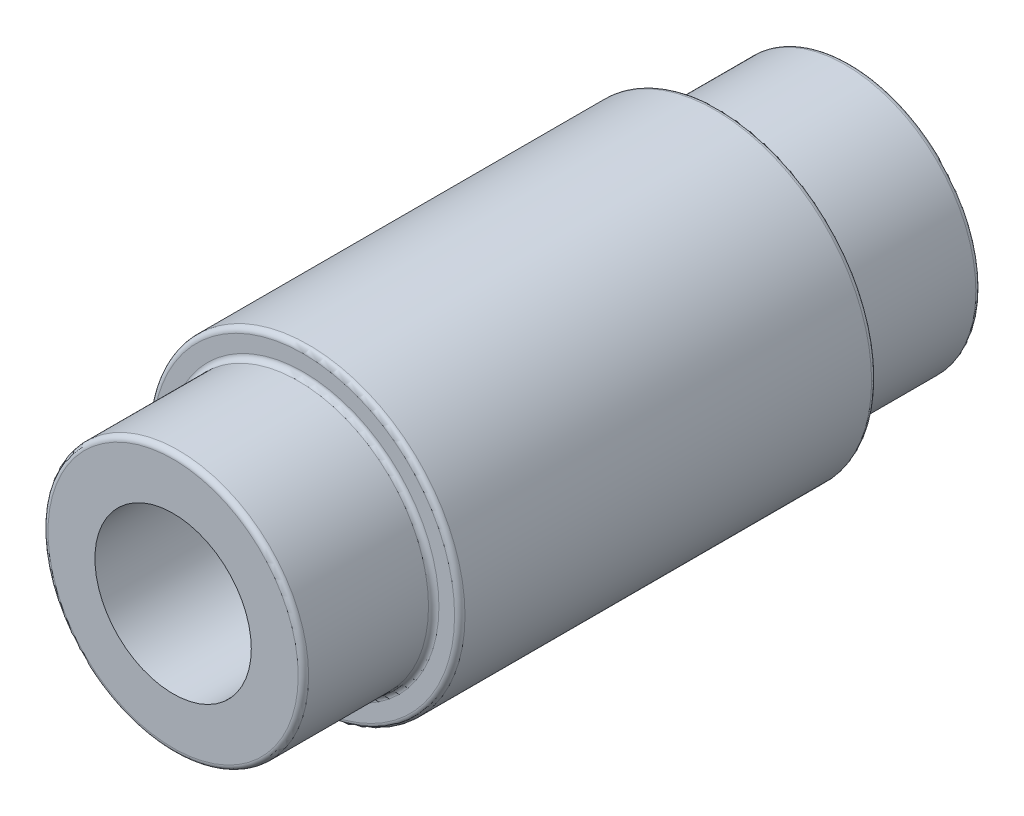
ISO-10303-21;
HEADER;
FILE_DESCRIPTION(('STEP AP214'),'2;1');
FILE_NAME('part.step','',(''),(''),'','','');
FILE_SCHEMA(('AUTOMOTIVE_DESIGN { 1 0 10303 214 1 1 1 1 }'));
ENDSEC;
DATA;
#1=APPLICATION_CONTEXT('core data for automotive mechanical design processes');
#2=APPLICATION_PROTOCOL_DEFINITION('international standard','automotive_design',2000,#1);
#3=PRODUCT_CONTEXT('',#1,'mechanical');
#4=PRODUCT('Part','Part','',(#3));
#5=PRODUCT_RELATED_PRODUCT_CATEGORY('part','',(#4));
#6=PRODUCT_DEFINITION_FORMATION('','',#4);
#7=PRODUCT_DEFINITION_CONTEXT('part definition',#1,'design');
#8=PRODUCT_DEFINITION('design','',#6,#7);
#9=PRODUCT_DEFINITION_SHAPE('','',#8);
#10=(LENGTH_UNIT() NAMED_UNIT(*) SI_UNIT(.MILLI.,.METRE.));
#11=(NAMED_UNIT(*) PLANE_ANGLE_UNIT() SI_UNIT($,.RADIAN.));
#12=(NAMED_UNIT(*) SI_UNIT($,.STERADIAN.) SOLID_ANGLE_UNIT());
#13=UNCERTAINTY_MEASURE_WITH_UNIT(LENGTH_MEASURE(1.E-05),#10,'distance_accuracy_value','');
#14=(GEOMETRIC_REPRESENTATION_CONTEXT(3) GLOBAL_UNCERTAINTY_ASSIGNED_CONTEXT((#13)) GLOBAL_UNIT_ASSIGNED_CONTEXT((#10,
#11,#12)) REPRESENTATION_CONTEXT('',''));
#15=CARTESIAN_POINT('',(0.,0.,0.));
#16=DIRECTION('',(0.,0.,1.));
#17=DIRECTION('',(1.,0.,0.));
#18=AXIS2_PLACEMENT_3D('',#15,#16,#17);
#19=CARTESIAN_POINT('',(0.,0.,0.4));
#20=DIRECTION('',(0.,0.,-1.));
#21=DIRECTION('',(-1.,0.,0.));
#22=AXIS2_PLACEMENT_3D('',#19,#20,#21);
#23=CYLINDRICAL_SURFACE('',#22,0.3);
#24=CARTESIAN_POINT('',(0.,0.,-0.39));
#25=DIRECTION('',(0.,0.,1.));
#26=DIRECTION('',(1.,0.,0.));
#27=AXIS2_PLACEMENT_3D('',#24,#25,#26);
#28=CIRCLE('',#27,0.3);
#29=CARTESIAN_POINT('',(0.3,0.,-0.39));
#30=VERTEX_POINT('',#29);
#31=EDGE_CURVE('E69',#30,#30,#28,.T.);
#32=ORIENTED_EDGE('',*,*,#31,.T.);
#33=EDGE_LOOP('',(#32));
#34=FACE_BOUND('',#33,.T.);
#35=CARTESIAN_POINT('',(0.,0.,0.39));
#36=DIRECTION('',(0.,0.,1.));
#37=DIRECTION('',(1.,0.,0.));
#38=AXIS2_PLACEMENT_3D('',#35,#36,#37);
#39=CIRCLE('',#38,0.3);
#40=CARTESIAN_POINT('',(0.3,0.,0.39));
#41=VERTEX_POINT('',#40);
#42=EDGE_CURVE('E72',#41,#41,#39,.F.);
#43=ORIENTED_EDGE('',*,*,#42,.T.);
#44=EDGE_LOOP('',(#43));
#45=FACE_BOUND('',#44,.T.);
#46=ADVANCED_FACE('F31',(#34,#45),#23,.T.);
#47=CARTESIAN_POINT('',(0.,0.,0.4));
#48=DIRECTION('',(0.,0.,1.));
#49=DIRECTION('',(1.,0.,0.));
#50=AXIS2_PLACEMENT_3D('',#47,#48,#49);
#51=PLANE('',#50);
#52=CARTESIAN_POINT('',(0.,0.,0.4));
#53=DIRECTION('',(0.,0.,1.));
#54=DIRECTION('',(1.,0.,0.));
#55=AXIS2_PLACEMENT_3D('',#52,#53,#54);
#56=CIRCLE('',#55,0.26);
#57=CARTESIAN_POINT('',(0.26,0.,0.4));
#58=VERTEX_POINT('',#57);
#59=EDGE_CURVE('E38',#58,#58,#56,.F.);
#60=ORIENTED_EDGE('',*,*,#59,.T.);
#61=EDGE_LOOP('',(#60));
#62=FACE_BOUND('',#61,.T.);
#63=CARTESIAN_POINT('',(0.,0.,0.4));
#64=DIRECTION('',(0.,0.,1.));
#65=DIRECTION('',(1.,0.,0.));
#66=AXIS2_PLACEMENT_3D('',#63,#64,#65);
#67=CIRCLE('',#66,0.29);
#68=CARTESIAN_POINT('',(0.29,0.,0.4));
#69=VERTEX_POINT('',#68);
#70=EDGE_CURVE('E63',#69,#69,#67,.T.);
#71=ORIENTED_EDGE('',*,*,#70,.T.);
#72=EDGE_LOOP('',(#71));
#73=FACE_BOUND('',#72,.T.);
#74=ADVANCED_FACE('F103',(#62,#73),#51,.T.);
#75=CARTESIAN_POINT('',(0.,0.,-0.4));
#76=DIRECTION('',(0.,0.,1.));
#77=DIRECTION('',(1.,0.,0.));
#78=AXIS2_PLACEMENT_3D('',#75,#76,#77);
#79=PLANE('',#78);
#80=CARTESIAN_POINT('',(0.,0.,-0.4));
#81=DIRECTION('',(0.,0.,1.));
#82=DIRECTION('',(1.,0.,0.));
#83=AXIS2_PLACEMENT_3D('',#80,#81,#82);
#84=CIRCLE('',#83,0.26);
#85=CARTESIAN_POINT('',(0.26,0.,-0.4));
#86=VERTEX_POINT('',#85);
#87=EDGE_CURVE('E42',#86,#86,#84,.T.);
#88=ORIENTED_EDGE('',*,*,#87,.T.);
#89=EDGE_LOOP('',(#88));
#90=FACE_BOUND('',#89,.T.);
#91=CARTESIAN_POINT('',(0.,0.,-0.4));
#92=DIRECTION('',(0.,0.,1.));
#93=DIRECTION('',(1.,0.,0.));
#94=AXIS2_PLACEMENT_3D('',#91,#92,#93);
#95=CIRCLE('',#94,0.29);
#96=CARTESIAN_POINT('',(0.29,0.,-0.4));
#97=VERTEX_POINT('',#96);
#98=EDGE_CURVE('E66',#97,#97,#95,.F.);
#99=ORIENTED_EDGE('',*,*,#98,.T.);
#100=EDGE_LOOP('',(#99));
#101=FACE_BOUND('',#100,.T.);
#102=ADVANCED_FACE('F109',(#90,#101),#79,.F.);
#103=CARTESIAN_POINT('',(0.,0.,-0.65));
#104=DIRECTION('',(0.,0.,1.));
#105=DIRECTION('',(1.,0.,0.));
#106=AXIS2_PLACEMENT_3D('',#103,#104,#105);
#107=PLANE('',#106);
#108=CARTESIAN_POINT('',(0.,0.,-0.65));
#109=DIRECTION('',(0.,0.,1.));
#110=DIRECTION('',(1.,0.,0.));
#111=AXIS2_PLACEMENT_3D('',#108,#109,#110);
#112=CIRCLE('',#111,0.24);
#113=CARTESIAN_POINT('',(0.24,0.,-0.65));
#114=VERTEX_POINT('',#113);
#115=EDGE_CURVE('E57',#114,#114,#112,.F.);
#116=ORIENTED_EDGE('',*,*,#115,.T.);
#117=EDGE_LOOP('',(#116));
#118=FACE_BOUND('',#117,.T.);
#119=CARTESIAN_POINT('',(0.,0.,-0.65));
#120=DIRECTION('',(0.,0.,1.));
#121=DIRECTION('',(1.,0.,0.));
#122=AXIS2_PLACEMENT_3D('',#119,#120,#121);
#123=CIRCLE('',#122,0.15);
#124=CARTESIAN_POINT('',(0.15,0.,-0.65));
#125=VERTEX_POINT('',#124);
#126=EDGE_CURVE('E75',#125,#125,#123,.T.);
#127=ORIENTED_EDGE('',*,*,#126,.T.);
#128=EDGE_LOOP('',(#127));
#129=FACE_BOUND('',#128,.T.);
#130=ADVANCED_FACE('F82',(#118,#129),#107,.F.);
#131=CARTESIAN_POINT('',(0.,0.,0.65));
#132=DIRECTION('',(0.,0.,-1.));
#133=DIRECTION('',(-1.,0.,0.));
#134=AXIS2_PLACEMENT_3D('',#131,#132,#133);
#135=CYLINDRICAL_SURFACE('',#134,0.25);
#136=CARTESIAN_POINT('',(0.,0.,-0.41));
#137=DIRECTION('',(0.,0.,1.));
#138=DIRECTION('',(1.,0.,0.));
#139=AXIS2_PLACEMENT_3D('',#136,#137,#138);
#140=CIRCLE('',#139,0.25);
#141=CARTESIAN_POINT('',(0.25,0.,-0.41));
#142=VERTEX_POINT('',#141);
#143=EDGE_CURVE('E46',#142,#142,#140,.F.);
#144=ORIENTED_EDGE('',*,*,#143,.T.);
#145=EDGE_LOOP('',(#144));
#146=FACE_BOUND('',#145,.T.);
#147=CARTESIAN_POINT('',(0.,0.,-0.64));
#148=DIRECTION('',(0.,0.,1.));
#149=DIRECTION('',(1.,0.,0.));
#150=AXIS2_PLACEMENT_3D('',#147,#148,#149);
#151=CIRCLE('',#150,0.25);
#152=CARTESIAN_POINT('',(0.25,0.,-0.64));
#153=VERTEX_POINT('',#152);
#154=EDGE_CURVE('E60',#153,#153,#151,.T.);
#155=ORIENTED_EDGE('',*,*,#154,.T.);
#156=EDGE_LOOP('',(#155));
#157=FACE_BOUND('',#156,.T.);
#158=ADVANCED_FACE('F99',(#146,#157),#135,.T.);
#159=CARTESIAN_POINT('',(0.,0.,0.41));
#160=DIRECTION('',(0.,0.,1.));
#161=DIRECTION('',(1.,0.,0.));
#162=AXIS2_PLACEMENT_3D('',#159,#160,#161);
#163=CIRCLE('',#162,0.25);
#164=CARTESIAN_POINT('',(0.25,0.,0.41));
#165=VERTEX_POINT('',#164);
#166=EDGE_CURVE('E10',#165,#165,#163,.T.);
#167=ORIENTED_EDGE('',*,*,#166,.T.);
#168=EDGE_LOOP('',(#167));
#169=FACE_BOUND('',#168,.T.);
#170=CARTESIAN_POINT('',(0.,0.,0.64));
#171=DIRECTION('',(0.,0.,1.));
#172=DIRECTION('',(1.,0.,0.));
#173=AXIS2_PLACEMENT_3D('',#170,#171,#172);
#174=CIRCLE('',#173,0.25);
#175=CARTESIAN_POINT('',(0.25,0.,0.64));
#176=VERTEX_POINT('',#175);
#177=EDGE_CURVE('E51',#176,#176,#174,.F.);
#178=ORIENTED_EDGE('',*,*,#177,.T.);
#179=EDGE_LOOP('',(#178));
#180=FACE_BOUND('',#179,.T.);
#181=ADVANCED_FACE('F93',(#169,#180),#135,.T.);
#182=CARTESIAN_POINT('',(0.,0.,0.65));
#183=DIRECTION('',(0.,0.,1.));
#184=DIRECTION('',(1.,0.,0.));
#185=AXIS2_PLACEMENT_3D('',#182,#183,#184);
#186=PLANE('',#185);
#187=CARTESIAN_POINT('',(0.,0.,0.65));
#188=DIRECTION('',(0.,0.,1.));
#189=DIRECTION('',(1.,0.,0.));
#190=AXIS2_PLACEMENT_3D('',#187,#188,#189);
#191=CIRCLE('',#190,0.24);
#192=CARTESIAN_POINT('',(0.24,0.,0.65));
#193=VERTEX_POINT('',#192);
#194=EDGE_CURVE('E54',#193,#193,#191,.T.);
#195=ORIENTED_EDGE('',*,*,#194,.T.);
#196=EDGE_LOOP('',(#195));
#197=FACE_BOUND('',#196,.T.);
#198=CARTESIAN_POINT('',(0.,0.,0.65));
#199=DIRECTION('',(0.,0.,1.));
#200=DIRECTION('',(1.,0.,0.));
#201=AXIS2_PLACEMENT_3D('',#198,#199,#200);
#202=CIRCLE('',#201,0.15);
#203=CARTESIAN_POINT('',(0.15,0.,0.65));
#204=VERTEX_POINT('',#203);
#205=EDGE_CURVE('E76',#204,#204,#202,.T.);
#206=ORIENTED_EDGE('',*,*,#205,.F.);
#207=EDGE_LOOP('',(#206));
#208=FACE_BOUND('',#207,.T.);
#209=ADVANCED_FACE('F88',(#197,#208),#186,.T.);
#210=CARTESIAN_POINT('',(0.,0.,-0.65));
#211=DIRECTION('',(0.,0.,1.));
#212=DIRECTION('',(1.,0.,0.));
#213=AXIS2_PLACEMENT_3D('',#210,#211,#212);
#214=CYLINDRICAL_SURFACE('',#213,0.15);
#215=ORIENTED_EDGE('',*,*,#126,.F.);
#216=EDGE_LOOP('',(#215));
#217=FACE_BOUND('',#216,.T.);
#218=ORIENTED_EDGE('',*,*,#205,.T.);
#219=EDGE_LOOP('',(#218));
#220=FACE_BOUND('',#219,.T.);
#221=ADVANCED_FACE('F84',(#217,#220),#214,.F.);
#222=CARTESIAN_POINT('',(0.,0.,-0.39));
#223=DIRECTION('',(0.,0.,1.));
#224=DIRECTION('',(1.,0.,0.));
#225=AXIS2_PLACEMENT_3D('',#222,#223,#224);
#226=TOROIDAL_SURFACE('',#225,0.29,0.01);
#227=ORIENTED_EDGE('',*,*,#98,.F.);
#228=EDGE_LOOP('',(#227));
#229=FACE_BOUND('',#228,.T.);
#230=ORIENTED_EDGE('',*,*,#31,.F.);
#231=EDGE_LOOP('',(#230));
#232=FACE_BOUND('',#231,.T.);
#233=ADVANCED_FACE('F87',(#229,#232),#226,.T.);
#234=CARTESIAN_POINT('',(0.,0.,0.39));
#235=DIRECTION('',(0.,0.,1.));
#236=DIRECTION('',(1.,0.,0.));
#237=AXIS2_PLACEMENT_3D('',#234,#235,#236);
#238=TOROIDAL_SURFACE('',#237,0.29,0.01);
#239=ORIENTED_EDGE('',*,*,#42,.F.);
#240=EDGE_LOOP('',(#239));
#241=FACE_BOUND('',#240,.T.);
#242=ORIENTED_EDGE('',*,*,#70,.F.);
#243=EDGE_LOOP('',(#242));
#244=FACE_BOUND('',#243,.T.);
#245=ADVANCED_FACE('F116',(#241,#244),#238,.T.);
#246=CARTESIAN_POINT('',(0.,0.,-0.64));
#247=DIRECTION('',(0.,0.,1.));
#248=DIRECTION('',(1.,0.,0.));
#249=AXIS2_PLACEMENT_3D('',#246,#247,#248);
#250=TOROIDAL_SURFACE('',#249,0.24,0.01);
#251=ORIENTED_EDGE('',*,*,#115,.F.);
#252=EDGE_LOOP('',(#251));
#253=FACE_BOUND('',#252,.T.);
#254=ORIENTED_EDGE('',*,*,#154,.F.);
#255=EDGE_LOOP('',(#254));
#256=FACE_BOUND('',#255,.T.);
#257=ADVANCED_FACE('F120',(#253,#256),#250,.T.);
#258=CARTESIAN_POINT('',(0.,0.,0.64));
#259=DIRECTION('',(0.,0.,1.));
#260=DIRECTION('',(1.,0.,0.));
#261=AXIS2_PLACEMENT_3D('',#258,#259,#260);
#262=TOROIDAL_SURFACE('',#261,0.24,0.01);
#263=ORIENTED_EDGE('',*,*,#177,.F.);
#264=EDGE_LOOP('',(#263));
#265=FACE_BOUND('',#264,.T.);
#266=ORIENTED_EDGE('',*,*,#194,.F.);
#267=EDGE_LOOP('',(#266));
#268=FACE_BOUND('',#267,.T.);
#269=ADVANCED_FACE('F124',(#265,#268),#262,.T.);
#270=CARTESIAN_POINT('',(0.,0.,-0.41));
#271=DIRECTION('',(0.,0.,1.));
#272=DIRECTION('',(1.,0.,0.));
#273=AXIS2_PLACEMENT_3D('',#270,#271,#272);
#274=TOROIDAL_SURFACE('',#273,0.26,0.01);
#275=ORIENTED_EDGE('',*,*,#87,.F.);
#276=EDGE_LOOP('',(#275));
#277=FACE_BOUND('',#276,.T.);
#278=ORIENTED_EDGE('',*,*,#143,.F.);
#279=EDGE_LOOP('',(#278));
#280=FACE_BOUND('',#279,.T.);
#281=ADVANCED_FACE('F127',(#277,#280),#274,.F.);
#282=CARTESIAN_POINT('',(0.,0.,0.41));
#283=DIRECTION('',(0.,0.,1.));
#284=DIRECTION('',(1.,0.,0.));
#285=AXIS2_PLACEMENT_3D('',#282,#283,#284);
#286=TOROIDAL_SURFACE('',#285,0.26,0.01);
#287=ORIENTED_EDGE('',*,*,#166,.F.);
#288=EDGE_LOOP('',(#287));
#289=FACE_BOUND('',#288,.T.);
#290=ORIENTED_EDGE('',*,*,#59,.F.);
#291=EDGE_LOOP('',(#290));
#292=FACE_BOUND('',#291,.T.);
#293=ADVANCED_FACE('F33',(#289,#292),#286,.F.);
#294=CLOSED_SHELL('',(#46,#74,#102,#130,#158,#181,#209,#221,#233,#245,#257,#269,#281,#293));
#295=MANIFOLD_SOLID_BREP('B2',#294);
#296=ADVANCED_BREP_SHAPE_REPRESENTATION('',(#18,#295),#14);
#297=SHAPE_DEFINITION_REPRESENTATION(#9,#296);
ENDSEC;
END-ISO-10303-21;
